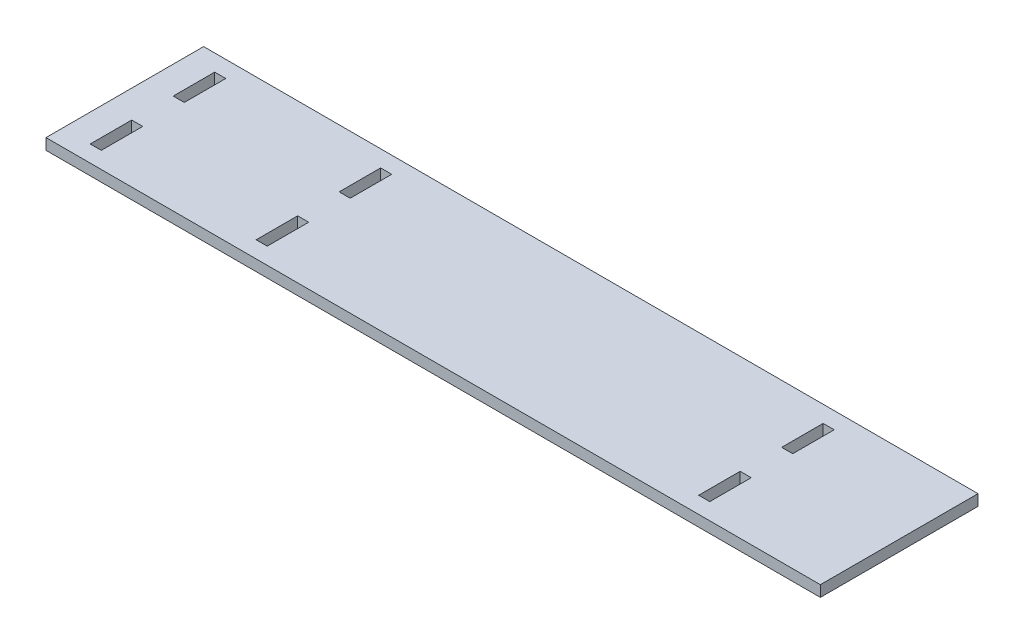
ISO-10303-21;
HEADER;
FILE_DESCRIPTION(('STEP AP214'),'2;1');
FILE_NAME('part.step','',(''),(''),'','','');
FILE_SCHEMA(('AUTOMOTIVE_DESIGN { 1 0 10303 214 1 1 1 1 }'));
ENDSEC;
DATA;
#1=APPLICATION_CONTEXT('core data for automotive mechanical design processes');
#2=APPLICATION_PROTOCOL_DEFINITION('international standard','automotive_design',2000,#1);
#3=PRODUCT_CONTEXT('',#1,'mechanical');
#4=PRODUCT('Part','Part','',(#3));
#5=PRODUCT_RELATED_PRODUCT_CATEGORY('part','',(#4));
#6=PRODUCT_DEFINITION_FORMATION('','',#4);
#7=PRODUCT_DEFINITION_CONTEXT('part definition',#1,'design');
#8=PRODUCT_DEFINITION('design','',#6,#7);
#9=PRODUCT_DEFINITION_SHAPE('','',#8);
#10=(LENGTH_UNIT() NAMED_UNIT(*) SI_UNIT(.MILLI.,.METRE.));
#11=(NAMED_UNIT(*) PLANE_ANGLE_UNIT() SI_UNIT($,.RADIAN.));
#12=(NAMED_UNIT(*) SI_UNIT($,.STERADIAN.) SOLID_ANGLE_UNIT());
#13=UNCERTAINTY_MEASURE_WITH_UNIT(LENGTH_MEASURE(1.E-05),#10,'distance_accuracy_value','');
#14=(GEOMETRIC_REPRESENTATION_CONTEXT(3) GLOBAL_UNCERTAINTY_ASSIGNED_CONTEXT((#13)) GLOBAL_UNIT_ASSIGNED_CONTEXT((#10,
#11,#12)) REPRESENTATION_CONTEXT('',''));
#15=CARTESIAN_POINT('',(0.,0.,0.));
#16=DIRECTION('',(0.,0.,1.));
#17=DIRECTION('',(1.,0.,0.));
#18=AXIS2_PLACEMENT_3D('',#15,#16,#17);
#19=CARTESIAN_POINT('',(0.,4.,0.));
#20=DIRECTION('',(0.,-1.,0.));
#21=DIRECTION('',(0.,0.,-1.));
#22=AXIS2_PLACEMENT_3D('',#19,#20,#21);
#23=PLANE('',#22);
#24=DIRECTION('',(-1.,0.,0.));
#25=VECTOR('',#24,1.);
#26=CARTESIAN_POINT('',(0.,4.,-9.99999999999997));
#27=LINE('',#26,#25);
#28=CARTESIAN_POINT('',(74.,4.,-10.));
#29=VERTEX_POINT('',#28);
#30=CARTESIAN_POINT('',(70.,4.,-10.));
#31=VERTEX_POINT('',#30);
#32=EDGE_CURVE('E316',#29,#31,#27,.T.);
#33=ORIENTED_EDGE('',*,*,#32,.T.);
#34=DIRECTION('',(0.,0.,-1.));
#35=VECTOR('',#34,1.);
#36=CARTESIAN_POINT('',(70.,4.,0.));
#37=LINE('',#36,#35);
#38=CARTESIAN_POINT('',(70.,4.,-25.));
#39=VERTEX_POINT('',#38);
#40=EDGE_CURVE('E349',#31,#39,#37,.T.);
#41=ORIENTED_EDGE('',*,*,#40,.T.);
#42=DIRECTION('',(-1.,0.,0.));
#43=VECTOR('',#42,1.);
#44=CARTESIAN_POINT('',(0.,4.,-25.0000000000001));
#45=LINE('',#44,#43);
#46=CARTESIAN_POINT('',(74.,4.,-25.));
#47=VERTEX_POINT('',#46);
#48=EDGE_CURVE('E353',#47,#39,#45,.T.);
#49=ORIENTED_EDGE('',*,*,#48,.F.);
#50=DIRECTION('',(0.,0.,-1.));
#51=VECTOR('',#50,1.);
#52=CARTESIAN_POINT('',(74.,4.,0.));
#53=LINE('',#52,#51);
#54=EDGE_CURVE('E356',#29,#47,#53,.T.);
#55=ORIENTED_EDGE('',*,*,#54,.F.);
#56=EDGE_LOOP('',(#33,#41,#49,#55));
#57=FACE_BOUND('',#56,.T.);
#58=DIRECTION('',(-1.,0.,0.));
#59=VECTOR('',#58,1.);
#60=CARTESIAN_POINT('',(0.,4.,-9.9999999999999));
#61=LINE('',#60,#59);
#62=CARTESIAN_POINT('',(234.,4.,-10.));
#63=VERTEX_POINT('',#62);
#64=CARTESIAN_POINT('',(230.,4.,-10.));
#65=VERTEX_POINT('',#64);
#66=EDGE_CURVE('E418',#63,#65,#61,.T.);
#67=ORIENTED_EDGE('',*,*,#66,.T.);
#68=DIRECTION('',(0.,0.,1.));
#69=VECTOR('',#68,1.);
#70=CARTESIAN_POINT('',(230.,4.,0.));
#71=LINE('',#70,#69);
#72=CARTESIAN_POINT('',(230.,4.,-25.));
#73=VERTEX_POINT('',#72);
#74=EDGE_CURVE('E408',#73,#65,#71,.T.);
#75=ORIENTED_EDGE('',*,*,#74,.F.);
#76=DIRECTION('',(-1.,0.,0.));
#77=VECTOR('',#76,1.);
#78=CARTESIAN_POINT('',(0.,4.,-25.0000000000002));
#79=LINE('',#78,#77);
#80=CARTESIAN_POINT('',(234.,4.,-25.));
#81=VERTEX_POINT('',#80);
#82=EDGE_CURVE('E412',#81,#73,#79,.T.);
#83=ORIENTED_EDGE('',*,*,#82,.F.);
#84=DIRECTION('',(0.,0.,1.));
#85=VECTOR('',#84,1.);
#86=CARTESIAN_POINT('',(234.,4.,0.));
#87=LINE('',#86,#85);
#88=EDGE_CURVE('E415',#81,#63,#87,.T.);
#89=ORIENTED_EDGE('',*,*,#88,.T.);
#90=EDGE_LOOP('',(#67,#75,#83,#89));
#91=FACE_BOUND('',#90,.T.);
#92=DIRECTION('',(0.,0.,-1.));
#93=VECTOR('',#92,1.);
#94=CARTESIAN_POINT('',(280.,4.,0.));
#95=LINE('',#94,#93);
#96=CARTESIAN_POINT('',(280.,4.,-4.));
#97=VERTEX_POINT('',#96);
#98=CARTESIAN_POINT('',(280.,4.,-61.));
#99=VERTEX_POINT('',#98);
#100=EDGE_CURVE('E11',#97,#99,#95,.T.);
#101=ORIENTED_EDGE('',*,*,#100,.T.);
#102=DIRECTION('',(1.,0.,0.));
#103=VECTOR('',#102,1.);
#104=CARTESIAN_POINT('',(0.,4.,-61.));
#105=LINE('',#104,#103);
#106=CARTESIAN_POINT('',(0.,4.,-61.));
#107=VERTEX_POINT('',#106);
#108=EDGE_CURVE('E50',#107,#99,#105,.T.);
#109=ORIENTED_EDGE('',*,*,#108,.F.);
#110=DIRECTION('',(0.,0.,1.));
#111=VECTOR('',#110,1.);
#112=CARTESIAN_POINT('',(0.,4.,0.));
#113=LINE('',#112,#111);
#114=CARTESIAN_POINT('',(0.,4.,-4.));
#115=VERTEX_POINT('',#114);
#116=EDGE_CURVE('E42',#107,#115,#113,.T.);
#117=ORIENTED_EDGE('',*,*,#116,.T.);
#118=DIRECTION('',(-1.,0.,0.));
#119=VECTOR('',#118,1.);
#120=CARTESIAN_POINT('',(0.,4.,-4.));
#121=LINE('',#120,#119);
#122=EDGE_CURVE('E433',#97,#115,#121,.T.);
#123=ORIENTED_EDGE('',*,*,#122,.F.);
#124=EDGE_LOOP('',(#101,#109,#117,#123));
#125=FACE_BOUND('',#124,.T.);
#126=DIRECTION('',(0.,0.,-1.));
#127=VECTOR('',#126,1.);
#128=CARTESIAN_POINT('',(10.,4.,0.));
#129=LINE('',#128,#127);
#130=CARTESIAN_POINT('',(10.,4.,-39.9999999999996));
#131=VERTEX_POINT('',#130);
#132=CARTESIAN_POINT('',(10.,4.,-54.9999999999996));
#133=VERTEX_POINT('',#132);
#134=EDGE_CURVE('E260',#131,#133,#129,.T.);
#135=ORIENTED_EDGE('',*,*,#134,.T.);
#136=DIRECTION('',(1.,0.,0.));
#137=VECTOR('',#136,1.);
#138=CARTESIAN_POINT('',(0.,4.,-54.9999999999996));
#139=LINE('',#138,#137);
#140=CARTESIAN_POINT('',(14.,4.,-54.9999999999996));
#141=VERTEX_POINT('',#140);
#142=EDGE_CURVE('E250',#133,#141,#139,.T.);
#143=ORIENTED_EDGE('',*,*,#142,.T.);
#144=DIRECTION('',(0.,0.,-1.));
#145=VECTOR('',#144,1.);
#146=CARTESIAN_POINT('',(14.,4.,0.));
#147=LINE('',#146,#145);
#148=CARTESIAN_POINT('',(14.,4.,-39.9999999999996));
#149=VERTEX_POINT('',#148);
#150=EDGE_CURVE('E254',#149,#141,#147,.T.);
#151=ORIENTED_EDGE('',*,*,#150,.F.);
#152=DIRECTION('',(1.,0.,0.));
#153=VECTOR('',#152,1.);
#154=CARTESIAN_POINT('',(0.,4.,-39.9999999999996));
#155=LINE('',#154,#153);
#156=EDGE_CURVE('E257',#131,#149,#155,.T.);
#157=ORIENTED_EDGE('',*,*,#156,.F.);
#158=EDGE_LOOP('',(#135,#143,#151,#157));
#159=FACE_BOUND('',#158,.T.);
#160=DIRECTION('',(1.,0.,0.));
#161=VECTOR('',#160,1.);
#162=CARTESIAN_POINT('',(0.,4.,-40.));
#163=LINE('',#162,#161);
#164=CARTESIAN_POINT('',(230.,4.,-40.));
#165=VERTEX_POINT('',#164);
#166=CARTESIAN_POINT('',(234.,4.,-40.));
#167=VERTEX_POINT('',#166);
#168=EDGE_CURVE('E290',#165,#167,#163,.T.);
#169=ORIENTED_EDGE('',*,*,#168,.F.);
#170=DIRECTION('',(0.,0.,1.));
#171=VECTOR('',#170,1.);
#172=CARTESIAN_POINT('',(230.,4.,0.));
#173=LINE('',#172,#171);
#174=CARTESIAN_POINT('',(230.,4.,-55.));
#175=VERTEX_POINT('',#174);
#176=EDGE_CURVE('E293',#175,#165,#173,.T.);
#177=ORIENTED_EDGE('',*,*,#176,.F.);
#178=DIRECTION('',(1.,0.,0.));
#179=VECTOR('',#178,1.);
#180=CARTESIAN_POINT('',(0.,4.,-55.));
#181=LINE('',#180,#179);
#182=CARTESIAN_POINT('',(234.,4.,-55.));
#183=VERTEX_POINT('',#182);
#184=EDGE_CURVE('E283',#175,#183,#181,.T.);
#185=ORIENTED_EDGE('',*,*,#184,.T.);
#186=DIRECTION('',(0.,0.,1.));
#187=VECTOR('',#186,1.);
#188=CARTESIAN_POINT('',(234.,4.,0.));
#189=LINE('',#188,#187);
#190=EDGE_CURVE('E287',#183,#167,#189,.T.);
#191=ORIENTED_EDGE('',*,*,#190,.T.);
#192=EDGE_LOOP('',(#169,#177,#185,#191));
#193=FACE_BOUND('',#192,.T.);
#194=DIRECTION('',(0.,0.,-1.));
#195=VECTOR('',#194,1.);
#196=CARTESIAN_POINT('',(70.,4.,0.));
#197=LINE('',#196,#195);
#198=CARTESIAN_POINT('',(70.,4.,-40.));
#199=VERTEX_POINT('',#198);
#200=CARTESIAN_POINT('',(70.,4.,-55.));
#201=VERTEX_POINT('',#200);
#202=EDGE_CURVE('E282',#199,#201,#197,.T.);
#203=ORIENTED_EDGE('',*,*,#202,.T.);
#204=DIRECTION('',(1.,0.,0.));
#205=VECTOR('',#204,1.);
#206=CARTESIAN_POINT('',(0.,4.,-55.));
#207=LINE('',#206,#205);
#208=CARTESIAN_POINT('',(74.,4.,-55.));
#209=VERTEX_POINT('',#208);
#210=EDGE_CURVE('E317',#201,#209,#207,.T.);
#211=ORIENTED_EDGE('',*,*,#210,.T.);
#212=DIRECTION('',(0.,0.,-1.));
#213=VECTOR('',#212,1.);
#214=CARTESIAN_POINT('',(74.,4.,0.));
#215=LINE('',#214,#213);
#216=CARTESIAN_POINT('',(74.,4.,-40.));
#217=VERTEX_POINT('',#216);
#218=EDGE_CURVE('E321',#217,#209,#215,.T.);
#219=ORIENTED_EDGE('',*,*,#218,.F.);
#220=DIRECTION('',(1.,0.,0.));
#221=VECTOR('',#220,1.);
#222=CARTESIAN_POINT('',(0.,4.,-40.));
#223=LINE('',#222,#221);
#224=EDGE_CURVE('E324',#199,#217,#223,.T.);
#225=ORIENTED_EDGE('',*,*,#224,.F.);
#226=EDGE_LOOP('',(#203,#211,#219,#225));
#227=FACE_BOUND('',#226,.T.);
#228=DIRECTION('',(-1.,0.,0.));
#229=VECTOR('',#228,1.);
#230=CARTESIAN_POINT('',(0.,4.,-9.99999999999958));
#231=LINE('',#230,#229);
#232=CARTESIAN_POINT('',(14.,4.,-9.99999999999958));
#233=VERTEX_POINT('',#232);
#234=CARTESIAN_POINT('',(10.,4.,-9.99999999999958));
#235=VERTEX_POINT('',#234);
#236=EDGE_CURVE('E348',#233,#235,#231,.T.);
#237=ORIENTED_EDGE('',*,*,#236,.T.);
#238=DIRECTION('',(0.,0.,-1.));
#239=VECTOR('',#238,1.);
#240=CARTESIAN_POINT('',(10.,4.,0.));
#241=LINE('',#240,#239);
#242=CARTESIAN_POINT('',(10.,4.,-24.9999999999996));
#243=VERTEX_POINT('',#242);
#244=EDGE_CURVE('E379',#235,#243,#241,.T.);
#245=ORIENTED_EDGE('',*,*,#244,.T.);
#246=DIRECTION('',(-1.,0.,0.));
#247=VECTOR('',#246,1.);
#248=CARTESIAN_POINT('',(0.,4.,-24.9999999999996));
#249=LINE('',#248,#247);
#250=CARTESIAN_POINT('',(14.,4.,-24.9999999999996));
#251=VERTEX_POINT('',#250);
#252=EDGE_CURVE('E383',#251,#243,#249,.T.);
#253=ORIENTED_EDGE('',*,*,#252,.F.);
#254=DIRECTION('',(0.,0.,-1.));
#255=VECTOR('',#254,1.);
#256=CARTESIAN_POINT('',(14.,4.,0.));
#257=LINE('',#256,#255);
#258=EDGE_CURVE('E386',#233,#251,#257,.T.);
#259=ORIENTED_EDGE('',*,*,#258,.F.);
#260=EDGE_LOOP('',(#237,#245,#253,#259));
#261=FACE_BOUND('',#260,.T.);
#262=ADVANCED_FACE('F33',(#57,#91,#125,#159,#193,#227,#261),#23,.F.);
#263=CARTESIAN_POINT('',(0.,0.,0.));
#264=DIRECTION('',(0.,-1.,0.));
#265=DIRECTION('',(0.,0.,-1.));
#266=AXIS2_PLACEMENT_3D('',#263,#264,#265);
#267=PLANE('',#266);
#268=DIRECTION('',(1.,0.,0.));
#269=VECTOR('',#268,1.);
#270=CARTESIAN_POINT('',(0.,0.,-61.));
#271=LINE('',#270,#269);
#272=CARTESIAN_POINT('',(0.,0.,-61.));
#273=VERTEX_POINT('',#272);
#274=CARTESIAN_POINT('',(280.,0.,-61.));
#275=VERTEX_POINT('',#274);
#276=EDGE_CURVE('E218',#273,#275,#271,.T.);
#277=ORIENTED_EDGE('',*,*,#276,.T.);
#278=DIRECTION('',(0.,0.,-1.));
#279=VECTOR('',#278,1.);
#280=CARTESIAN_POINT('',(280.,0.,0.));
#281=LINE('',#280,#279);
#282=CARTESIAN_POINT('',(280.,0.,-4.));
#283=VERTEX_POINT('',#282);
#284=EDGE_CURVE('E37',#283,#275,#281,.T.);
#285=ORIENTED_EDGE('',*,*,#284,.F.);
#286=DIRECTION('',(-1.,0.,0.));
#287=VECTOR('',#286,1.);
#288=CARTESIAN_POINT('',(0.,0.,-4.));
#289=LINE('',#288,#287);
#290=CARTESIAN_POINT('',(0.,0.,-4.));
#291=VERTEX_POINT('',#290);
#292=EDGE_CURVE('E58',#283,#291,#289,.T.);
#293=ORIENTED_EDGE('',*,*,#292,.T.);
#294=DIRECTION('',(0.,0.,1.));
#295=VECTOR('',#294,1.);
#296=CARTESIAN_POINT('',(0.,0.,0.));
#297=LINE('',#296,#295);
#298=EDGE_CURVE('E232',#273,#291,#297,.T.);
#299=ORIENTED_EDGE('',*,*,#298,.F.);
#300=EDGE_LOOP('',(#277,#285,#293,#299));
#301=FACE_BOUND('',#300,.T.);
#302=DIRECTION('',(0.,0.,1.));
#303=VECTOR('',#302,1.);
#304=CARTESIAN_POINT('',(230.,0.,0.));
#305=LINE('',#304,#303);
#306=CARTESIAN_POINT('',(230.,0.,-55.));
#307=VERTEX_POINT('',#306);
#308=CARTESIAN_POINT('',(230.,0.,-40.));
#309=VERTEX_POINT('',#308);
#310=EDGE_CURVE('E286',#307,#309,#305,.T.);
#311=ORIENTED_EDGE('',*,*,#310,.T.);
#312=DIRECTION('',(1.,0.,0.));
#313=VECTOR('',#312,1.);
#314=CARTESIAN_POINT('',(0.,0.,-40.));
#315=LINE('',#314,#313);
#316=CARTESIAN_POINT('',(234.,0.,-40.));
#317=VERTEX_POINT('',#316);
#318=EDGE_CURVE('E300',#309,#317,#315,.T.);
#319=ORIENTED_EDGE('',*,*,#318,.T.);
#320=DIRECTION('',(0.,0.,1.));
#321=VECTOR('',#320,1.);
#322=CARTESIAN_POINT('',(234.,0.,0.));
#323=LINE('',#322,#321);
#324=CARTESIAN_POINT('',(234.,0.,-55.));
#325=VERTEX_POINT('',#324);
#326=EDGE_CURVE('E297',#325,#317,#323,.T.);
#327=ORIENTED_EDGE('',*,*,#326,.F.);
#328=DIRECTION('',(1.,0.,0.));
#329=VECTOR('',#328,1.);
#330=CARTESIAN_POINT('',(0.,0.,-55.));
#331=LINE('',#330,#329);
#332=EDGE_CURVE('E276',#307,#325,#331,.T.);
#333=ORIENTED_EDGE('',*,*,#332,.F.);
#334=EDGE_LOOP('',(#311,#319,#327,#333));
#335=FACE_BOUND('',#334,.T.);
#336=DIRECTION('',(1.,0.,0.));
#337=VECTOR('',#336,1.);
#338=CARTESIAN_POINT('',(0.,0.,-54.9999999999996));
#339=LINE('',#338,#337);
#340=CARTESIAN_POINT('',(10.,0.,-54.9999999999996));
#341=VERTEX_POINT('',#340);
#342=CARTESIAN_POINT('',(14.,0.,-54.9999999999996));
#343=VERTEX_POINT('',#342);
#344=EDGE_CURVE('E247',#341,#343,#339,.T.);
#345=ORIENTED_EDGE('',*,*,#344,.F.);
#346=DIRECTION('',(0.,0.,-1.));
#347=VECTOR('',#346,1.);
#348=CARTESIAN_POINT('',(10.,0.,0.));
#349=LINE('',#348,#347);
#350=CARTESIAN_POINT('',(10.,0.,-39.9999999999996));
#351=VERTEX_POINT('',#350);
#352=EDGE_CURVE('E253',#351,#341,#349,.T.);
#353=ORIENTED_EDGE('',*,*,#352,.F.);
#354=DIRECTION('',(1.,0.,0.));
#355=VECTOR('',#354,1.);
#356=CARTESIAN_POINT('',(0.,0.,-39.9999999999996));
#357=LINE('',#356,#355);
#358=CARTESIAN_POINT('',(14.,0.,-39.9999999999996));
#359=VERTEX_POINT('',#358);
#360=EDGE_CURVE('E268',#351,#359,#357,.T.);
#361=ORIENTED_EDGE('',*,*,#360,.T.);
#362=DIRECTION('',(0.,0.,-1.));
#363=VECTOR('',#362,1.);
#364=CARTESIAN_POINT('',(14.,0.,0.));
#365=LINE('',#364,#363);
#366=EDGE_CURVE('E265',#359,#343,#365,.T.);
#367=ORIENTED_EDGE('',*,*,#366,.T.);
#368=EDGE_LOOP('',(#345,#353,#361,#367));
#369=FACE_BOUND('',#368,.T.);
#370=DIRECTION('',(0.,0.,1.));
#371=VECTOR('',#370,1.);
#372=CARTESIAN_POINT('',(230.,0.,0.));
#373=LINE('',#372,#371);
#374=CARTESIAN_POINT('',(230.,0.,-25.));
#375=VERTEX_POINT('',#374);
#376=CARTESIAN_POINT('',(230.,0.,-10.));
#377=VERTEX_POINT('',#376);
#378=EDGE_CURVE('E403',#375,#377,#373,.T.);
#379=ORIENTED_EDGE('',*,*,#378,.T.);
#380=DIRECTION('',(-1.,0.,0.));
#381=VECTOR('',#380,1.);
#382=CARTESIAN_POINT('',(0.,0.,-9.9999999999999));
#383=LINE('',#382,#381);
#384=CARTESIAN_POINT('',(234.,0.,-10.));
#385=VERTEX_POINT('',#384);
#386=EDGE_CURVE('E411',#385,#377,#383,.T.);
#387=ORIENTED_EDGE('',*,*,#386,.F.);
#388=DIRECTION('',(0.,0.,1.));
#389=VECTOR('',#388,1.);
#390=CARTESIAN_POINT('',(234.,0.,0.));
#391=LINE('',#390,#389);
#392=CARTESIAN_POINT('',(234.,0.,-25.));
#393=VERTEX_POINT('',#392);
#394=EDGE_CURVE('E426',#393,#385,#391,.T.);
#395=ORIENTED_EDGE('',*,*,#394,.F.);
#396=DIRECTION('',(-1.,0.,0.));
#397=VECTOR('',#396,1.);
#398=CARTESIAN_POINT('',(0.,0.,-25.0000000000002));
#399=LINE('',#398,#397);
#400=EDGE_CURVE('E423',#393,#375,#399,.T.);
#401=ORIENTED_EDGE('',*,*,#400,.T.);
#402=EDGE_LOOP('',(#379,#387,#395,#401));
#403=FACE_BOUND('',#402,.T.);
#404=DIRECTION('',(1.,0.,0.));
#405=VECTOR('',#404,1.);
#406=CARTESIAN_POINT('',(0.,0.,-55.));
#407=LINE('',#406,#405);
#408=CARTESIAN_POINT('',(70.,0.,-55.));
#409=VERTEX_POINT('',#408);
#410=CARTESIAN_POINT('',(74.,0.,-55.));
#411=VERTEX_POINT('',#410);
#412=EDGE_CURVE('E309',#409,#411,#407,.T.);
#413=ORIENTED_EDGE('',*,*,#412,.F.);
#414=DIRECTION('',(0.,0.,-1.));
#415=VECTOR('',#414,1.);
#416=CARTESIAN_POINT('',(70.,0.,0.));
#417=LINE('',#416,#415);
#418=CARTESIAN_POINT('',(70.,0.,-40.));
#419=VERTEX_POINT('',#418);
#420=EDGE_CURVE('E320',#419,#409,#417,.T.);
#421=ORIENTED_EDGE('',*,*,#420,.F.);
#422=DIRECTION('',(1.,0.,0.));
#423=VECTOR('',#422,1.);
#424=CARTESIAN_POINT('',(0.,0.,-40.));
#425=LINE('',#424,#423);
#426=CARTESIAN_POINT('',(74.,0.,-40.));
#427=VERTEX_POINT('',#426);
#428=EDGE_CURVE('E333',#419,#427,#425,.T.);
#429=ORIENTED_EDGE('',*,*,#428,.T.);
#430=DIRECTION('',(0.,0.,-1.));
#431=VECTOR('',#430,1.);
#432=CARTESIAN_POINT('',(74.,0.,0.));
#433=LINE('',#432,#431);
#434=EDGE_CURVE('E330',#427,#411,#433,.T.);
#435=ORIENTED_EDGE('',*,*,#434,.T.);
#436=EDGE_LOOP('',(#413,#421,#429,#435));
#437=FACE_BOUND('',#436,.T.);
#438=DIRECTION('',(0.,0.,-1.));
#439=VECTOR('',#438,1.);
#440=CARTESIAN_POINT('',(70.,0.,0.));
#441=LINE('',#440,#439);
#442=CARTESIAN_POINT('',(70.,0.,-10.));
#443=VERTEX_POINT('',#442);
#444=CARTESIAN_POINT('',(70.,0.,-25.));
#445=VERTEX_POINT('',#444);
#446=EDGE_CURVE('E341',#443,#445,#441,.T.);
#447=ORIENTED_EDGE('',*,*,#446,.F.);
#448=DIRECTION('',(-1.,0.,0.));
#449=VECTOR('',#448,1.);
#450=CARTESIAN_POINT('',(0.,0.,-9.99999999999997));
#451=LINE('',#450,#449);
#452=CARTESIAN_POINT('',(74.,0.,-10.));
#453=VERTEX_POINT('',#452);
#454=EDGE_CURVE('E352',#453,#443,#451,.T.);
#455=ORIENTED_EDGE('',*,*,#454,.F.);
#456=DIRECTION('',(0.,0.,-1.));
#457=VECTOR('',#456,1.);
#458=CARTESIAN_POINT('',(74.,0.,0.));
#459=LINE('',#458,#457);
#460=CARTESIAN_POINT('',(74.,0.,-25.));
#461=VERTEX_POINT('',#460);
#462=EDGE_CURVE('E365',#453,#461,#459,.T.);
#463=ORIENTED_EDGE('',*,*,#462,.T.);
#464=DIRECTION('',(-1.,0.,0.));
#465=VECTOR('',#464,1.);
#466=CARTESIAN_POINT('',(0.,0.,-25.0000000000001));
#467=LINE('',#466,#465);
#468=EDGE_CURVE('E362',#461,#445,#467,.T.);
#469=ORIENTED_EDGE('',*,*,#468,.T.);
#470=EDGE_LOOP('',(#447,#455,#463,#469));
#471=FACE_BOUND('',#470,.T.);
#472=DIRECTION('',(0.,0.,-1.));
#473=VECTOR('',#472,1.);
#474=CARTESIAN_POINT('',(10.,0.,0.));
#475=LINE('',#474,#473);
#476=CARTESIAN_POINT('',(10.,0.,-9.99999999999958));
#477=VERTEX_POINT('',#476);
#478=CARTESIAN_POINT('',(10.,0.,-24.9999999999996));
#479=VERTEX_POINT('',#478);
#480=EDGE_CURVE('E373',#477,#479,#475,.T.);
#481=ORIENTED_EDGE('',*,*,#480,.F.);
#482=DIRECTION('',(-1.,0.,0.));
#483=VECTOR('',#482,1.);
#484=CARTESIAN_POINT('',(0.,0.,-9.99999999999958));
#485=LINE('',#484,#483);
#486=CARTESIAN_POINT('',(14.,0.,-9.99999999999958));
#487=VERTEX_POINT('',#486);
#488=EDGE_CURVE('E382',#487,#477,#485,.T.);
#489=ORIENTED_EDGE('',*,*,#488,.F.);
#490=DIRECTION('',(0.,0.,-1.));
#491=VECTOR('',#490,1.);
#492=CARTESIAN_POINT('',(14.,0.,0.));
#493=LINE('',#492,#491);
#494=CARTESIAN_POINT('',(14.,0.,-24.9999999999996));
#495=VERTEX_POINT('',#494);
#496=EDGE_CURVE('E395',#487,#495,#493,.T.);
#497=ORIENTED_EDGE('',*,*,#496,.T.);
#498=DIRECTION('',(-1.,0.,0.));
#499=VECTOR('',#498,1.);
#500=CARTESIAN_POINT('',(0.,0.,-24.9999999999996));
#501=LINE('',#500,#499);
#502=EDGE_CURVE('E392',#495,#479,#501,.T.);
#503=ORIENTED_EDGE('',*,*,#502,.T.);
#504=EDGE_LOOP('',(#481,#489,#497,#503));
#505=FACE_BOUND('',#504,.T.);
#506=ADVANCED_FACE('F235',(#301,#335,#369,#403,#437,#471,#505),#267,.T.);
#507=CARTESIAN_POINT('',(0.,4.,0.));
#508=DIRECTION('',(1.,0.,0.));
#509=DIRECTION('',(0.,0.,-1.));
#510=AXIS2_PLACEMENT_3D('',#507,#508,#509);
#511=PLANE('',#510);
#512=ORIENTED_EDGE('',*,*,#116,.F.);
#513=DIRECTION('',(0.,1.,0.));
#514=VECTOR('',#513,1.);
#515=CARTESIAN_POINT('',(0.,0.,-61.));
#516=LINE('',#515,#514);
#517=EDGE_CURVE('E221',#273,#107,#516,.T.);
#518=ORIENTED_EDGE('',*,*,#517,.F.);
#519=ORIENTED_EDGE('',*,*,#298,.T.);
#520=DIRECTION('',(0.,1.,0.));
#521=VECTOR('',#520,1.);
#522=CARTESIAN_POINT('',(0.,0.,-4.));
#523=LINE('',#522,#521);
#524=EDGE_CURVE('E431',#291,#115,#523,.T.);
#525=ORIENTED_EDGE('',*,*,#524,.T.);
#526=EDGE_LOOP('',(#512,#518,#519,#525));
#527=FACE_BOUND('',#526,.T.);
#528=ADVANCED_FACE('F35',(#527),#511,.F.);
#529=CARTESIAN_POINT('',(280.,4.,0.));
#530=DIRECTION('',(-1.,0.,0.));
#531=DIRECTION('',(0.,0.,1.));
#532=AXIS2_PLACEMENT_3D('',#529,#530,#531);
#533=PLANE('',#532);
#534=ORIENTED_EDGE('',*,*,#284,.T.);
#535=DIRECTION('',(0.,1.,0.));
#536=VECTOR('',#535,1.);
#537=CARTESIAN_POINT('',(280.,0.,-61.));
#538=LINE('',#537,#536);
#539=EDGE_CURVE('E222',#275,#99,#538,.T.);
#540=ORIENTED_EDGE('',*,*,#539,.T.);
#541=ORIENTED_EDGE('',*,*,#100,.F.);
#542=DIRECTION('',(0.,1.,0.));
#543=VECTOR('',#542,1.);
#544=CARTESIAN_POINT('',(280.,0.,-4.));
#545=LINE('',#544,#543);
#546=EDGE_CURVE('E429',#283,#97,#545,.T.);
#547=ORIENTED_EDGE('',*,*,#546,.F.);
#548=EDGE_LOOP('',(#534,#540,#541,#547));
#549=FACE_BOUND('',#548,.T.);
#550=ADVANCED_FACE('F439',(#549),#533,.F.);
#551=CARTESIAN_POINT('',(10.,0.,0.));
#552=DIRECTION('',(1.,0.,0.));
#553=DIRECTION('',(0.,0.,-1.));
#554=AXIS2_PLACEMENT_3D('',#551,#552,#553);
#555=PLANE('',#554);
#556=ORIENTED_EDGE('',*,*,#134,.F.);
#557=DIRECTION('',(0.,1.,0.));
#558=VECTOR('',#557,1.);
#559=CARTESIAN_POINT('',(10.,0.,-39.9999999999996));
#560=LINE('',#559,#558);
#561=EDGE_CURVE('E243',#351,#131,#560,.T.);
#562=ORIENTED_EDGE('',*,*,#561,.F.);
#563=ORIENTED_EDGE('',*,*,#352,.T.);
#564=DIRECTION('',(0.,1.,0.));
#565=VECTOR('',#564,1.);
#566=CARTESIAN_POINT('',(10.,0.,-54.9999999999996));
#567=LINE('',#566,#565);
#568=EDGE_CURVE('E237',#341,#133,#567,.T.);
#569=ORIENTED_EDGE('',*,*,#568,.T.);
#570=EDGE_LOOP('',(#556,#562,#563,#569));
#571=FACE_BOUND('',#570,.T.);
#572=ADVANCED_FACE('F465',(#571),#555,.T.);
#573=CARTESIAN_POINT('',(0.,0.,-54.9999999999996));
#574=DIRECTION('',(0.,0.,1.));
#575=DIRECTION('',(1.,0.,0.));
#576=AXIS2_PLACEMENT_3D('',#573,#574,#575);
#577=PLANE('',#576);
#578=ORIENTED_EDGE('',*,*,#142,.F.);
#579=ORIENTED_EDGE('',*,*,#568,.F.);
#580=ORIENTED_EDGE('',*,*,#344,.T.);
#581=DIRECTION('',(0.,1.,0.));
#582=VECTOR('',#581,1.);
#583=CARTESIAN_POINT('',(14.,0.,-54.9999999999996));
#584=LINE('',#583,#582);
#585=EDGE_CURVE('E239',#343,#141,#584,.T.);
#586=ORIENTED_EDGE('',*,*,#585,.T.);
#587=EDGE_LOOP('',(#578,#579,#580,#586));
#588=FACE_BOUND('',#587,.T.);
#589=ADVANCED_FACE('F472',(#588),#577,.T.);
#590=CARTESIAN_POINT('',(14.,0.,0.));
#591=DIRECTION('',(1.,0.,0.));
#592=DIRECTION('',(0.,0.,-1.));
#593=AXIS2_PLACEMENT_3D('',#590,#591,#592);
#594=PLANE('',#593);
#595=ORIENTED_EDGE('',*,*,#150,.T.);
#596=ORIENTED_EDGE('',*,*,#585,.F.);
#597=ORIENTED_EDGE('',*,*,#366,.F.);
#598=DIRECTION('',(0.,1.,0.));
#599=VECTOR('',#598,1.);
#600=CARTESIAN_POINT('',(14.,0.,-39.9999999999996));
#601=LINE('',#600,#599);
#602=EDGE_CURVE('E246',#359,#149,#601,.T.);
#603=ORIENTED_EDGE('',*,*,#602,.T.);
#604=EDGE_LOOP('',(#595,#596,#597,#603));
#605=FACE_BOUND('',#604,.T.);
#606=ADVANCED_FACE('F697',(#605),#594,.F.);
#607=CARTESIAN_POINT('',(0.,0.,-39.9999999999996));
#608=DIRECTION('',(0.,0.,1.));
#609=DIRECTION('',(1.,0.,0.));
#610=AXIS2_PLACEMENT_3D('',#607,#608,#609);
#611=PLANE('',#610);
#612=ORIENTED_EDGE('',*,*,#156,.T.);
#613=ORIENTED_EDGE('',*,*,#602,.F.);
#614=ORIENTED_EDGE('',*,*,#360,.F.);
#615=ORIENTED_EDGE('',*,*,#561,.T.);
#616=EDGE_LOOP('',(#612,#613,#614,#615));
#617=FACE_BOUND('',#616,.T.);
#618=ADVANCED_FACE('F687',(#617),#611,.F.);
#619=CARTESIAN_POINT('',(0.,0.,-9.9999999999999));
#620=DIRECTION('',(0.,0.,-1.));
#621=DIRECTION('',(-1.,0.,0.));
#622=AXIS2_PLACEMENT_3D('',#619,#620,#621);
#623=PLANE('',#622);
#624=ORIENTED_EDGE('',*,*,#66,.F.);
#625=DIRECTION('',(0.,1.,0.));
#626=VECTOR('',#625,1.);
#627=CARTESIAN_POINT('',(234.,0.,-10.));
#628=LINE('',#627,#626);
#629=EDGE_CURVE('E399',#385,#63,#628,.T.);
#630=ORIENTED_EDGE('',*,*,#629,.F.);
#631=ORIENTED_EDGE('',*,*,#386,.T.);
#632=DIRECTION('',(0.,1.,0.));
#633=VECTOR('',#632,1.);
#634=CARTESIAN_POINT('',(230.,0.,-10.));
#635=LINE('',#634,#633);
#636=EDGE_CURVE('E295',#377,#65,#635,.T.);
#637=ORIENTED_EDGE('',*,*,#636,.T.);
#638=EDGE_LOOP('',(#624,#630,#631,#637));
#639=FACE_BOUND('',#638,.T.);
#640=ADVANCED_FACE('F678',(#639),#623,.T.);
#641=CARTESIAN_POINT('',(230.,0.,0.));
#642=DIRECTION('',(-1.,0.,0.));
#643=DIRECTION('',(0.,0.,1.));
#644=AXIS2_PLACEMENT_3D('',#641,#642,#643);
#645=PLANE('',#644);
#646=ORIENTED_EDGE('',*,*,#74,.T.);
#647=ORIENTED_EDGE('',*,*,#636,.F.);
#648=ORIENTED_EDGE('',*,*,#378,.F.);
#649=DIRECTION('',(0.,1.,0.));
#650=VECTOR('',#649,1.);
#651=CARTESIAN_POINT('',(230.,0.,-25.));
#652=LINE('',#651,#650);
#653=EDGE_CURVE('E405',#375,#73,#652,.T.);
#654=ORIENTED_EDGE('',*,*,#653,.T.);
#655=EDGE_LOOP('',(#646,#647,#648,#654));
#656=FACE_BOUND('',#655,.T.);
#657=ADVANCED_FACE('F668',(#656),#645,.F.);
#658=CARTESIAN_POINT('',(0.,0.,-25.0000000000002));
#659=DIRECTION('',(0.,0.,-1.));
#660=DIRECTION('',(-1.,0.,0.));
#661=AXIS2_PLACEMENT_3D('',#658,#659,#660);
#662=PLANE('',#661);
#663=ORIENTED_EDGE('',*,*,#82,.T.);
#664=ORIENTED_EDGE('',*,*,#653,.F.);
#665=ORIENTED_EDGE('',*,*,#400,.F.);
#666=DIRECTION('',(0.,1.,0.));
#667=VECTOR('',#666,1.);
#668=CARTESIAN_POINT('',(234.,0.,-25.));
#669=LINE('',#668,#667);
#670=EDGE_CURVE('E402',#393,#81,#669,.T.);
#671=ORIENTED_EDGE('',*,*,#670,.T.);
#672=EDGE_LOOP('',(#663,#664,#665,#671));
#673=FACE_BOUND('',#672,.T.);
#674=ADVANCED_FACE('F658',(#673),#662,.F.);
#675=CARTESIAN_POINT('',(234.,0.,0.));
#676=DIRECTION('',(-1.,0.,0.));
#677=DIRECTION('',(0.,0.,1.));
#678=AXIS2_PLACEMENT_3D('',#675,#676,#677);
#679=PLANE('',#678);
#680=ORIENTED_EDGE('',*,*,#88,.F.);
#681=ORIENTED_EDGE('',*,*,#670,.F.);
#682=ORIENTED_EDGE('',*,*,#394,.T.);
#683=ORIENTED_EDGE('',*,*,#629,.T.);
#684=EDGE_LOOP('',(#680,#681,#682,#683));
#685=FACE_BOUND('',#684,.T.);
#686=ADVANCED_FACE('F648',(#685),#679,.T.);
#687=CARTESIAN_POINT('',(230.,0.,0.));
#688=DIRECTION('',(-1.,0.,0.));
#689=DIRECTION('',(0.,0.,1.));
#690=AXIS2_PLACEMENT_3D('',#687,#688,#689);
#691=PLANE('',#690);
#692=ORIENTED_EDGE('',*,*,#176,.T.);
#693=DIRECTION('',(0.,1.,0.));
#694=VECTOR('',#693,1.);
#695=CARTESIAN_POINT('',(230.,0.,-40.));
#696=LINE('',#695,#694);
#697=EDGE_CURVE('E272',#309,#165,#696,.T.);
#698=ORIENTED_EDGE('',*,*,#697,.F.);
#699=ORIENTED_EDGE('',*,*,#310,.F.);
#700=DIRECTION('',(0.,1.,0.));
#701=VECTOR('',#700,1.);
#702=CARTESIAN_POINT('',(230.,0.,-55.));
#703=LINE('',#702,#701);
#704=EDGE_CURVE('E280',#307,#175,#703,.T.);
#705=ORIENTED_EDGE('',*,*,#704,.T.);
#706=EDGE_LOOP('',(#692,#698,#699,#705));
#707=FACE_BOUND('',#706,.T.);
#708=ADVANCED_FACE('F638',(#707),#691,.F.);
#709=CARTESIAN_POINT('',(0.,0.,-55.));
#710=DIRECTION('',(0.,0.,1.));
#711=DIRECTION('',(1.,0.,0.));
#712=AXIS2_PLACEMENT_3D('',#709,#710,#711);
#713=PLANE('',#712);
#714=ORIENTED_EDGE('',*,*,#184,.F.);
#715=ORIENTED_EDGE('',*,*,#704,.F.);
#716=ORIENTED_EDGE('',*,*,#332,.T.);
#717=DIRECTION('',(0.,1.,0.));
#718=VECTOR('',#717,1.);
#719=CARTESIAN_POINT('',(234.,0.,-55.));
#720=LINE('',#719,#718);
#721=EDGE_CURVE('E278',#325,#183,#720,.T.);
#722=ORIENTED_EDGE('',*,*,#721,.T.);
#723=EDGE_LOOP('',(#714,#715,#716,#722));
#724=FACE_BOUND('',#723,.T.);
#725=ADVANCED_FACE('F628',(#724),#713,.T.);
#726=CARTESIAN_POINT('',(234.,0.,0.));
#727=DIRECTION('',(-1.,0.,0.));
#728=DIRECTION('',(0.,0.,1.));
#729=AXIS2_PLACEMENT_3D('',#726,#727,#728);
#730=PLANE('',#729);
#731=ORIENTED_EDGE('',*,*,#190,.F.);
#732=ORIENTED_EDGE('',*,*,#721,.F.);
#733=ORIENTED_EDGE('',*,*,#326,.T.);
#734=DIRECTION('',(0.,1.,0.));
#735=VECTOR('',#734,1.);
#736=CARTESIAN_POINT('',(234.,0.,-40.));
#737=LINE('',#736,#735);
#738=EDGE_CURVE('E275',#317,#167,#737,.T.);
#739=ORIENTED_EDGE('',*,*,#738,.T.);
#740=EDGE_LOOP('',(#731,#732,#733,#739));
#741=FACE_BOUND('',#740,.T.);
#742=ADVANCED_FACE('F618',(#741),#730,.T.);
#743=CARTESIAN_POINT('',(0.,0.,-40.));
#744=DIRECTION('',(0.,0.,1.));
#745=DIRECTION('',(1.,0.,0.));
#746=AXIS2_PLACEMENT_3D('',#743,#744,#745);
#747=PLANE('',#746);
#748=ORIENTED_EDGE('',*,*,#168,.T.);
#749=ORIENTED_EDGE('',*,*,#738,.F.);
#750=ORIENTED_EDGE('',*,*,#318,.F.);
#751=ORIENTED_EDGE('',*,*,#697,.T.);
#752=EDGE_LOOP('',(#748,#749,#750,#751));
#753=FACE_BOUND('',#752,.T.);
#754=ADVANCED_FACE('F607',(#753),#747,.F.);
#755=CARTESIAN_POINT('',(70.,0.,0.));
#756=DIRECTION('',(1.,0.,0.));
#757=DIRECTION('',(0.,0.,-1.));
#758=AXIS2_PLACEMENT_3D('',#755,#756,#757);
#759=PLANE('',#758);
#760=ORIENTED_EDGE('',*,*,#202,.F.);
#761=DIRECTION('',(0.,1.,0.));
#762=VECTOR('',#761,1.);
#763=CARTESIAN_POINT('',(70.,0.,-40.));
#764=LINE('',#763,#762);
#765=EDGE_CURVE('E305',#419,#199,#764,.T.);
#766=ORIENTED_EDGE('',*,*,#765,.F.);
#767=ORIENTED_EDGE('',*,*,#420,.T.);
#768=DIRECTION('',(0.,1.,0.));
#769=VECTOR('',#768,1.);
#770=CARTESIAN_POINT('',(70.,0.,-55.));
#771=LINE('',#770,#769);
#772=EDGE_CURVE('E313',#409,#201,#771,.T.);
#773=ORIENTED_EDGE('',*,*,#772,.T.);
#774=EDGE_LOOP('',(#760,#766,#767,#773));
#775=FACE_BOUND('',#774,.T.);
#776=ADVANCED_FACE('F597',(#775),#759,.T.);
#777=CARTESIAN_POINT('',(0.,0.,-55.));
#778=DIRECTION('',(0.,0.,1.));
#779=DIRECTION('',(1.,0.,0.));
#780=AXIS2_PLACEMENT_3D('',#777,#778,#779);
#781=PLANE('',#780);
#782=ORIENTED_EDGE('',*,*,#210,.F.);
#783=ORIENTED_EDGE('',*,*,#772,.F.);
#784=ORIENTED_EDGE('',*,*,#412,.T.);
#785=DIRECTION('',(0.,1.,0.));
#786=VECTOR('',#785,1.);
#787=CARTESIAN_POINT('',(74.,0.,-55.));
#788=LINE('',#787,#786);
#789=EDGE_CURVE('E311',#411,#209,#788,.T.);
#790=ORIENTED_EDGE('',*,*,#789,.T.);
#791=EDGE_LOOP('',(#782,#783,#784,#790));
#792=FACE_BOUND('',#791,.T.);
#793=ADVANCED_FACE('F586',(#792),#781,.T.);
#794=CARTESIAN_POINT('',(74.,0.,0.));
#795=DIRECTION('',(1.,0.,0.));
#796=DIRECTION('',(0.,0.,-1.));
#797=AXIS2_PLACEMENT_3D('',#794,#795,#796);
#798=PLANE('',#797);
#799=ORIENTED_EDGE('',*,*,#218,.T.);
#800=ORIENTED_EDGE('',*,*,#789,.F.);
#801=ORIENTED_EDGE('',*,*,#434,.F.);
#802=DIRECTION('',(0.,1.,0.));
#803=VECTOR('',#802,1.);
#804=CARTESIAN_POINT('',(74.,0.,-40.));
#805=LINE('',#804,#803);
#806=EDGE_CURVE('E308',#427,#217,#805,.T.);
#807=ORIENTED_EDGE('',*,*,#806,.T.);
#808=EDGE_LOOP('',(#799,#800,#801,#807));
#809=FACE_BOUND('',#808,.T.);
#810=ADVANCED_FACE('F576',(#809),#798,.F.);
#811=CARTESIAN_POINT('',(0.,0.,-40.));
#812=DIRECTION('',(0.,0.,1.));
#813=DIRECTION('',(1.,0.,0.));
#814=AXIS2_PLACEMENT_3D('',#811,#812,#813);
#815=PLANE('',#814);
#816=ORIENTED_EDGE('',*,*,#224,.T.);
#817=ORIENTED_EDGE('',*,*,#806,.F.);
#818=ORIENTED_EDGE('',*,*,#428,.F.);
#819=ORIENTED_EDGE('',*,*,#765,.T.);
#820=EDGE_LOOP('',(#816,#817,#818,#819));
#821=FACE_BOUND('',#820,.T.);
#822=ADVANCED_FACE('F566',(#821),#815,.F.);
#823=CARTESIAN_POINT('',(0.,0.,-9.99999999999997));
#824=DIRECTION('',(0.,0.,-1.));
#825=DIRECTION('',(-1.,0.,0.));
#826=AXIS2_PLACEMENT_3D('',#823,#824,#825);
#827=PLANE('',#826);
#828=ORIENTED_EDGE('',*,*,#32,.F.);
#829=DIRECTION('',(0.,1.,0.));
#830=VECTOR('',#829,1.);
#831=CARTESIAN_POINT('',(74.,0.,-10.));
#832=LINE('',#831,#830);
#833=EDGE_CURVE('E337',#453,#29,#832,.T.);
#834=ORIENTED_EDGE('',*,*,#833,.F.);
#835=ORIENTED_EDGE('',*,*,#454,.T.);
#836=DIRECTION('',(0.,1.,0.));
#837=VECTOR('',#836,1.);
#838=CARTESIAN_POINT('',(70.,0.,-10.));
#839=LINE('',#838,#837);
#840=EDGE_CURVE('E345',#443,#31,#839,.T.);
#841=ORIENTED_EDGE('',*,*,#840,.T.);
#842=EDGE_LOOP('',(#828,#834,#835,#841));
#843=FACE_BOUND('',#842,.T.);
#844=ADVANCED_FACE('F555',(#843),#827,.T.);
#845=CARTESIAN_POINT('',(70.,0.,0.));
#846=DIRECTION('',(1.,0.,0.));
#847=DIRECTION('',(0.,0.,-1.));
#848=AXIS2_PLACEMENT_3D('',#845,#846,#847);
#849=PLANE('',#848);
#850=ORIENTED_EDGE('',*,*,#40,.F.);
#851=ORIENTED_EDGE('',*,*,#840,.F.);
#852=ORIENTED_EDGE('',*,*,#446,.T.);
#853=DIRECTION('',(0.,1.,0.));
#854=VECTOR('',#853,1.);
#855=CARTESIAN_POINT('',(70.,0.,-25.));
#856=LINE('',#855,#854);
#857=EDGE_CURVE('E343',#445,#39,#856,.T.);
#858=ORIENTED_EDGE('',*,*,#857,.T.);
#859=EDGE_LOOP('',(#850,#851,#852,#858));
#860=FACE_BOUND('',#859,.T.);
#861=ADVANCED_FACE('F545',(#860),#849,.T.);
#862=CARTESIAN_POINT('',(0.,0.,-25.0000000000001));
#863=DIRECTION('',(0.,0.,-1.));
#864=DIRECTION('',(-1.,0.,0.));
#865=AXIS2_PLACEMENT_3D('',#862,#863,#864);
#866=PLANE('',#865);
#867=ORIENTED_EDGE('',*,*,#48,.T.);
#868=ORIENTED_EDGE('',*,*,#857,.F.);
#869=ORIENTED_EDGE('',*,*,#468,.F.);
#870=DIRECTION('',(0.,1.,0.));
#871=VECTOR('',#870,1.);
#872=CARTESIAN_POINT('',(74.,0.,-25.));
#873=LINE('',#872,#871);
#874=EDGE_CURVE('E340',#461,#47,#873,.T.);
#875=ORIENTED_EDGE('',*,*,#874,.T.);
#876=EDGE_LOOP('',(#867,#868,#869,#875));
#877=FACE_BOUND('',#876,.T.);
#878=ADVANCED_FACE('F534',(#877),#866,.F.);
#879=CARTESIAN_POINT('',(74.,0.,0.));
#880=DIRECTION('',(1.,0.,0.));
#881=DIRECTION('',(0.,0.,-1.));
#882=AXIS2_PLACEMENT_3D('',#879,#880,#881);
#883=PLANE('',#882);
#884=ORIENTED_EDGE('',*,*,#54,.T.);
#885=ORIENTED_EDGE('',*,*,#874,.F.);
#886=ORIENTED_EDGE('',*,*,#462,.F.);
#887=ORIENTED_EDGE('',*,*,#833,.T.);
#888=EDGE_LOOP('',(#884,#885,#886,#887));
#889=FACE_BOUND('',#888,.T.);
#890=ADVANCED_FACE('F524',(#889),#883,.F.);
#891=CARTESIAN_POINT('',(0.,0.,-9.99999999999958));
#892=DIRECTION('',(0.,0.,-1.));
#893=DIRECTION('',(-1.,0.,0.));
#894=AXIS2_PLACEMENT_3D('',#891,#892,#893);
#895=PLANE('',#894);
#896=ORIENTED_EDGE('',*,*,#236,.F.);
#897=DIRECTION('',(0.,1.,0.));
#898=VECTOR('',#897,1.);
#899=CARTESIAN_POINT('',(14.,0.,-9.99999999999958));
#900=LINE('',#899,#898);
#901=EDGE_CURVE('E369',#487,#233,#900,.T.);
#902=ORIENTED_EDGE('',*,*,#901,.F.);
#903=ORIENTED_EDGE('',*,*,#488,.T.);
#904=DIRECTION('',(0.,1.,0.));
#905=VECTOR('',#904,1.);
#906=CARTESIAN_POINT('',(10.,0.,-9.99999999999958));
#907=LINE('',#906,#905);
#908=EDGE_CURVE('E263',#477,#235,#907,.T.);
#909=ORIENTED_EDGE('',*,*,#908,.T.);
#910=EDGE_LOOP('',(#896,#902,#903,#909));
#911=FACE_BOUND('',#910,.T.);
#912=ADVANCED_FACE('F513',(#911),#895,.T.);
#913=CARTESIAN_POINT('',(10.,0.,0.));
#914=DIRECTION('',(1.,0.,0.));
#915=DIRECTION('',(0.,0.,-1.));
#916=AXIS2_PLACEMENT_3D('',#913,#914,#915);
#917=PLANE('',#916);
#918=ORIENTED_EDGE('',*,*,#244,.F.);
#919=ORIENTED_EDGE('',*,*,#908,.F.);
#920=ORIENTED_EDGE('',*,*,#480,.T.);
#921=DIRECTION('',(0.,1.,0.));
#922=VECTOR('',#921,1.);
#923=CARTESIAN_POINT('',(10.,0.,-24.9999999999996));
#924=LINE('',#923,#922);
#925=EDGE_CURVE('E375',#479,#243,#924,.T.);
#926=ORIENTED_EDGE('',*,*,#925,.T.);
#927=EDGE_LOOP('',(#918,#919,#920,#926));
#928=FACE_BOUND('',#927,.T.);
#929=ADVANCED_FACE('F503',(#928),#917,.T.);
#930=CARTESIAN_POINT('',(0.,0.,-24.9999999999996));
#931=DIRECTION('',(0.,0.,-1.));
#932=DIRECTION('',(-1.,0.,0.));
#933=AXIS2_PLACEMENT_3D('',#930,#931,#932);
#934=PLANE('',#933);
#935=ORIENTED_EDGE('',*,*,#252,.T.);
#936=ORIENTED_EDGE('',*,*,#925,.F.);
#937=ORIENTED_EDGE('',*,*,#502,.F.);
#938=DIRECTION('',(0.,1.,0.));
#939=VECTOR('',#938,1.);
#940=CARTESIAN_POINT('',(14.,0.,-24.9999999999996));
#941=LINE('',#940,#939);
#942=EDGE_CURVE('E372',#495,#251,#941,.T.);
#943=ORIENTED_EDGE('',*,*,#942,.T.);
#944=EDGE_LOOP('',(#935,#936,#937,#943));
#945=FACE_BOUND('',#944,.T.);
#946=ADVANCED_FACE('F452',(#945),#934,.F.);
#947=CARTESIAN_POINT('',(14.,0.,0.));
#948=DIRECTION('',(1.,0.,0.));
#949=DIRECTION('',(0.,0.,-1.));
#950=AXIS2_PLACEMENT_3D('',#947,#948,#949);
#951=PLANE('',#950);
#952=ORIENTED_EDGE('',*,*,#258,.T.);
#953=ORIENTED_EDGE('',*,*,#942,.F.);
#954=ORIENTED_EDGE('',*,*,#496,.F.);
#955=ORIENTED_EDGE('',*,*,#901,.T.);
#956=EDGE_LOOP('',(#952,#953,#954,#955));
#957=FACE_BOUND('',#956,.T.);
#958=ADVANCED_FACE('F445',(#957),#951,.F.);
#959=CARTESIAN_POINT('',(0.,0.,-4.));
#960=DIRECTION('',(0.,0.,-1.));
#961=DIRECTION('',(-1.,0.,0.));
#962=AXIS2_PLACEMENT_3D('',#959,#960,#961);
#963=PLANE('',#962);
#964=ORIENTED_EDGE('',*,*,#122,.T.);
#965=ORIENTED_EDGE('',*,*,#524,.F.);
#966=ORIENTED_EDGE('',*,*,#292,.F.);
#967=ORIENTED_EDGE('',*,*,#546,.T.);
#968=EDGE_LOOP('',(#964,#965,#966,#967));
#969=FACE_BOUND('',#968,.T.);
#970=ADVANCED_FACE('F443',(#969),#963,.F.);
#971=CARTESIAN_POINT('',(0.,0.,-61.));
#972=DIRECTION('',(0.,0.,1.));
#973=DIRECTION('',(1.,0.,0.));
#974=AXIS2_PLACEMENT_3D('',#971,#972,#973);
#975=PLANE('',#974);
#976=ORIENTED_EDGE('',*,*,#108,.T.);
#977=ORIENTED_EDGE('',*,*,#539,.F.);
#978=ORIENTED_EDGE('',*,*,#276,.F.);
#979=ORIENTED_EDGE('',*,*,#517,.T.);
#980=EDGE_LOOP('',(#976,#977,#978,#979));
#981=FACE_BOUND('',#980,.T.);
#982=ADVANCED_FACE('F220',(#981),#975,.F.);
#983=CLOSED_SHELL('',(#262,#506,#528,#550,#572,#589,#606,#618,#640,#657,#674,#686,#708,#725,
#742,#754,#776,#793,#810,#822,#844,#861,#878,#890,#912,#929,#946,#958,#970,#982));
#984=MANIFOLD_SOLID_BREP('B2',#983);
#985=ADVANCED_BREP_SHAPE_REPRESENTATION('',(#18,#984),#14);
#986=SHAPE_DEFINITION_REPRESENTATION(#9,#985);
ENDSEC;
END-ISO-10303-21;
